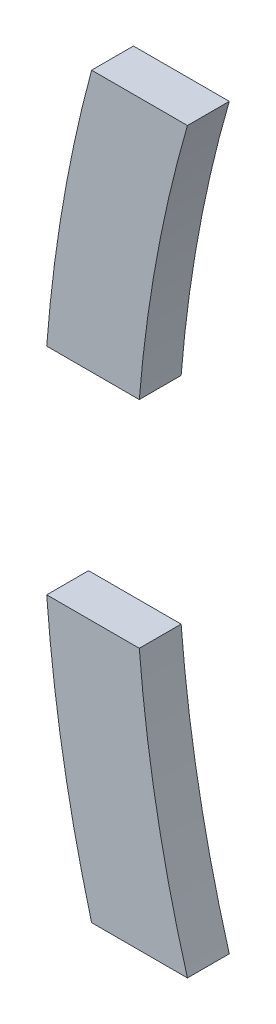
ISO-10303-21;
HEADER;
FILE_DESCRIPTION(('STEP AP214'),'2;1');
FILE_NAME('part.step','',(''),(''),'','','');
FILE_SCHEMA(('AUTOMOTIVE_DESIGN { 1 0 10303 214 1 1 1 1 }'));
ENDSEC;
DATA;
#1=APPLICATION_CONTEXT('core data for automotive mechanical design processes');
#2=APPLICATION_PROTOCOL_DEFINITION('international standard','automotive_design',2000,#1);
#3=PRODUCT_CONTEXT('',#1,'mechanical');
#4=PRODUCT('Part','Part','',(#3));
#5=PRODUCT_RELATED_PRODUCT_CATEGORY('part','',(#4));
#6=PRODUCT_DEFINITION_FORMATION('','',#4);
#7=PRODUCT_DEFINITION_CONTEXT('part definition',#1,'design');
#8=PRODUCT_DEFINITION('design','',#6,#7);
#9=PRODUCT_DEFINITION_SHAPE('','',#8);
#10=(LENGTH_UNIT() NAMED_UNIT(*) SI_UNIT(.MILLI.,.METRE.));
#11=(NAMED_UNIT(*) PLANE_ANGLE_UNIT() SI_UNIT($,.RADIAN.));
#12=(NAMED_UNIT(*) SI_UNIT($,.STERADIAN.) SOLID_ANGLE_UNIT());
#13=UNCERTAINTY_MEASURE_WITH_UNIT(LENGTH_MEASURE(1.E-05),#10,'distance_accuracy_value','');
#14=(GEOMETRIC_REPRESENTATION_CONTEXT(3) GLOBAL_UNCERTAINTY_ASSIGNED_CONTEXT((#13)) GLOBAL_UNIT_ASSIGNED_CONTEXT((#10,
#11,#12)) REPRESENTATION_CONTEXT('',''));
#15=CARTESIAN_POINT('',(0.,0.,0.));
#16=DIRECTION('',(0.,0.,1.));
#17=DIRECTION('',(1.,0.,0.));
#18=AXIS2_PLACEMENT_3D('',#15,#16,#17);
#19=CARTESIAN_POINT('',(0.,0.,17.272));
#20=DIRECTION('',(0.,0.,1.));
#21=DIRECTION('',(1.,0.,0.));
#22=AXIS2_PLACEMENT_3D('',#19,#20,#21);
#23=PLANE('',#22);
#24=CARTESIAN_POINT('',(0.,0.,17.272));
#25=DIRECTION('',(0.,0.,1.));
#26=DIRECTION('',(1.,0.,0.));
#27=AXIS2_PLACEMENT_3D('',#24,#25,#26);
#28=CIRCLE('',#27,584.2);
#29=CARTESIAN_POINT('',(-582.506512839127,-44.4500000000001,17.272));
#30=VERTEX_POINT('',#29);
#31=CARTESIAN_POINT('',(-563.971524103833,-152.4,17.272));
#32=VERTEX_POINT('',#31);
#33=EDGE_CURVE('E90',#30,#32,#28,.T.);
#34=ORIENTED_EDGE('',*,*,#33,.T.);
#35=DIRECTION('',(1.,0.,0.));
#36=VECTOR('',#35,1.);
#37=CARTESIAN_POINT('',(0.,-152.4,17.272));
#38=LINE('',#37,#36);
#39=CARTESIAN_POINT('',(-524.403899680389,-152.4,17.272));
#40=VERTEX_POINT('',#39);
#41=EDGE_CURVE('E81',#32,#40,#38,.T.);
#42=ORIENTED_EDGE('',*,*,#41,.T.);
#43=CARTESIAN_POINT('',(0.,0.,17.272));
#44=DIRECTION('',(0.,0.,-1.));
#45=DIRECTION('',(1.,0.,0.));
#46=AXIS2_PLACEMENT_3D('',#43,#44,#45);
#47=CIRCLE('',#46,546.1);
#48=CARTESIAN_POINT('',(-544.287982138132,-44.4500000000001,17.272));
#49=VERTEX_POINT('',#48);
#50=EDGE_CURVE('E89',#40,#49,#47,.T.);
#51=ORIENTED_EDGE('',*,*,#50,.T.);
#52=DIRECTION('',(1.,0.,0.));
#53=VECTOR('',#52,1.);
#54=CARTESIAN_POINT('',(0.,-44.4500000000001,17.272));
#55=LINE('',#54,#53);
#56=EDGE_CURVE('E55',#30,#49,#55,.T.);
#57=ORIENTED_EDGE('',*,*,#56,.F.);
#58=EDGE_LOOP('',(#34,#42,#51,#57));
#59=FACE_BOUND('',#58,.T.);
#60=ADVANCED_FACE('F46',(#59),#23,.T.);
#61=CARTESIAN_POINT('',(0.,0.,0.));
#62=DIRECTION('',(0.,0.,1.));
#63=DIRECTION('',(1.,0.,0.));
#64=AXIS2_PLACEMENT_3D('',#61,#62,#63);
#65=PLANE('',#64);
#66=DIRECTION('',(-1.,0.,0.));
#67=VECTOR('',#66,1.);
#68=CARTESIAN_POINT('',(0.,-152.4,0.));
#69=LINE('',#68,#67);
#70=CARTESIAN_POINT('',(-524.403899680389,-152.4,0.));
#71=VERTEX_POINT('',#70);
#72=CARTESIAN_POINT('',(-563.971524103833,-152.4,0.));
#73=VERTEX_POINT('',#72);
#74=EDGE_CURVE('E61',#71,#73,#69,.T.);
#75=ORIENTED_EDGE('',*,*,#74,.T.);
#76=CARTESIAN_POINT('',(0.,0.,0.));
#77=DIRECTION('',(0.,0.,1.));
#78=DIRECTION('',(1.,0.,0.));
#79=AXIS2_PLACEMENT_3D('',#76,#77,#78);
#80=CIRCLE('',#79,584.2);
#81=CARTESIAN_POINT('',(-582.506512839127,-44.4500000000001,0.));
#82=VERTEX_POINT('',#81);
#83=EDGE_CURVE('E98',#82,#73,#80,.T.);
#84=ORIENTED_EDGE('',*,*,#83,.F.);
#85=DIRECTION('',(-1.,0.,0.));
#86=VECTOR('',#85,1.);
#87=CARTESIAN_POINT('',(0.,-44.4500000000001,0.));
#88=LINE('',#87,#86);
#89=CARTESIAN_POINT('',(-544.287982138132,-44.4500000000001,0.));
#90=VERTEX_POINT('',#89);
#91=EDGE_CURVE('E104',#90,#82,#88,.T.);
#92=ORIENTED_EDGE('',*,*,#91,.F.);
#93=CARTESIAN_POINT('',(0.,0.,0.));
#94=DIRECTION('',(0.,0.,-1.));
#95=DIRECTION('',(1.,0.,0.));
#96=AXIS2_PLACEMENT_3D('',#93,#94,#95);
#97=CIRCLE('',#96,546.1);
#98=EDGE_CURVE('E49',#71,#90,#97,.T.);
#99=ORIENTED_EDGE('',*,*,#98,.F.);
#100=EDGE_LOOP('',(#75,#84,#92,#99));
#101=FACE_BOUND('',#100,.T.);
#102=ADVANCED_FACE('F120',(#101),#65,.F.);
#103=CARTESIAN_POINT('',(0.,0.,17.272));
#104=DIRECTION('',(0.,0.,-1.));
#105=DIRECTION('',(-1.,0.,0.));
#106=AXIS2_PLACEMENT_3D('',#103,#104,#105);
#107=CYLINDRICAL_SURFACE('',#106,546.1);
#108=DIRECTION('',(0.,0.,1.));
#109=VECTOR('',#108,1.);
#110=CARTESIAN_POINT('',(-524.403899680389,-152.4,-112.557965060382));
#111=LINE('',#110,#109);
#112=EDGE_CURVE('E12',#71,#40,#111,.T.);
#113=ORIENTED_EDGE('',*,*,#112,.F.);
#114=ORIENTED_EDGE('',*,*,#98,.T.);
#115=DIRECTION('',(0.,0.,1.));
#116=VECTOR('',#115,1.);
#117=CARTESIAN_POINT('',(-544.287982138132,-44.4500000000001,-112.557965060382));
#118=LINE('',#117,#116);
#119=EDGE_CURVE('E99',#90,#49,#118,.T.);
#120=ORIENTED_EDGE('',*,*,#119,.T.);
#121=ORIENTED_EDGE('',*,*,#50,.F.);
#122=EDGE_LOOP('',(#113,#114,#120,#121));
#123=FACE_BOUND('',#122,.T.);
#124=ADVANCED_FACE('F118',(#123),#107,.F.);
#125=CARTESIAN_POINT('',(0.,0.,17.272));
#126=DIRECTION('',(0.,0.,-1.));
#127=DIRECTION('',(-1.,0.,0.));
#128=AXIS2_PLACEMENT_3D('',#125,#126,#127);
#129=CYLINDRICAL_SURFACE('',#128,584.2);
#130=DIRECTION('',(0.,0.,1.));
#131=VECTOR('',#130,1.);
#132=CARTESIAN_POINT('',(-563.971524103833,-152.4,-112.557965060382));
#133=LINE('',#132,#131);
#134=EDGE_CURVE('E84',#73,#32,#133,.T.);
#135=ORIENTED_EDGE('',*,*,#134,.T.);
#136=ORIENTED_EDGE('',*,*,#33,.F.);
#137=DIRECTION('',(0.,0.,1.));
#138=VECTOR('',#137,1.);
#139=CARTESIAN_POINT('',(-582.506512839127,-44.4500000000001,-112.557965060382));
#140=LINE('',#139,#138);
#141=EDGE_CURVE('E105',#82,#30,#140,.T.);
#142=ORIENTED_EDGE('',*,*,#141,.F.);
#143=ORIENTED_EDGE('',*,*,#83,.T.);
#144=EDGE_LOOP('',(#135,#136,#142,#143));
#145=FACE_BOUND('',#144,.T.);
#146=ADVANCED_FACE('F95',(#145),#129,.T.);
#147=CARTESIAN_POINT('',(0.,-44.4500000000001,-112.557965060382));
#148=DIRECTION('',(0.,-1.,0.));
#149=DIRECTION('',(0.,0.,-1.));
#150=AXIS2_PLACEMENT_3D('',#147,#148,#149);
#151=PLANE('',#150);
#152=ORIENTED_EDGE('',*,*,#91,.T.);
#153=ORIENTED_EDGE('',*,*,#141,.T.);
#154=ORIENTED_EDGE('',*,*,#56,.T.);
#155=ORIENTED_EDGE('',*,*,#119,.F.);
#156=EDGE_LOOP('',(#152,#153,#154,#155));
#157=FACE_BOUND('',#156,.T.);
#158=ADVANCED_FACE('F119',(#157),#151,.F.);
#159=CARTESIAN_POINT('',(0.,-152.4,-112.557965060382));
#160=DIRECTION('',(0.,-1.,0.));
#161=DIRECTION('',(0.,0.,-1.));
#162=AXIS2_PLACEMENT_3D('',#159,#160,#161);
#163=PLANE('',#162);
#164=ORIENTED_EDGE('',*,*,#112,.T.);
#165=ORIENTED_EDGE('',*,*,#41,.F.);
#166=ORIENTED_EDGE('',*,*,#134,.F.);
#167=ORIENTED_EDGE('',*,*,#74,.F.);
#168=EDGE_LOOP('',(#164,#165,#166,#167));
#169=FACE_BOUND('',#168,.T.);
#170=ADVANCED_FACE('F83',(#169),#163,.T.);
#171=CLOSED_SHELL('',(#60,#102,#124,#146,#158,#170));
#172=MANIFOLD_SOLID_BREP('B2',#171);
#173=CARTESIAN_POINT('',(0.,0.,17.272));
#174=DIRECTION('',(0.,0.,-1.));
#175=DIRECTION('',(-1.,0.,0.));
#176=AXIS2_PLACEMENT_3D('',#173,#174,#175);
#177=CYLINDRICAL_SURFACE('',#176,546.1);
#178=DIRECTION('',(0.,0.,1.));
#179=VECTOR('',#178,1.);
#180=CARTESIAN_POINT('',(-544.287982138132,44.4499999999999,-112.557965060382));
#181=LINE('',#180,#179);
#182=CARTESIAN_POINT('',(-544.287982138132,44.4499999999999,0.));
#183=VERTEX_POINT('',#182);
#184=CARTESIAN_POINT('',(-544.287982138132,44.4499999999999,17.272));
#185=VERTEX_POINT('',#184);
#186=EDGE_CURVE('E228',#183,#185,#181,.T.);
#187=ORIENTED_EDGE('',*,*,#186,.F.);
#188=CARTESIAN_POINT('',(0.,0.,0.));
#189=DIRECTION('',(0.,0.,-1.));
#190=DIRECTION('',(1.,0.,0.));
#191=AXIS2_PLACEMENT_3D('',#188,#189,#190);
#192=CIRCLE('',#191,546.1);
#193=CARTESIAN_POINT('',(-524.403899680389,152.4,0.));
#194=VERTEX_POINT('',#193);
#195=EDGE_CURVE('E222',#183,#194,#192,.T.);
#196=ORIENTED_EDGE('',*,*,#195,.T.);
#197=DIRECTION('',(0.,0.,1.));
#198=VECTOR('',#197,1.);
#199=CARTESIAN_POINT('',(-524.403899680389,152.4,-112.557965060382));
#200=LINE('',#199,#198);
#201=CARTESIAN_POINT('',(-524.403899680389,152.4,17.272));
#202=VERTEX_POINT('',#201);
#203=EDGE_CURVE('E234',#194,#202,#200,.T.);
#204=ORIENTED_EDGE('',*,*,#203,.T.);
#205=CARTESIAN_POINT('',(0.,0.,17.272));
#206=DIRECTION('',(0.,0.,-1.));
#207=DIRECTION('',(1.,0.,0.));
#208=AXIS2_PLACEMENT_3D('',#205,#206,#207);
#209=CIRCLE('',#208,546.1);
#210=EDGE_CURVE('E177',#185,#202,#209,.T.);
#211=ORIENTED_EDGE('',*,*,#210,.F.);
#212=EDGE_LOOP('',(#187,#196,#204,#211));
#213=FACE_BOUND('',#212,.T.);
#214=ADVANCED_FACE('F169',(#213),#177,.F.);
#215=CARTESIAN_POINT('',(0.,0.,17.272));
#216=DIRECTION('',(0.,0.,-1.));
#217=DIRECTION('',(-1.,0.,0.));
#218=AXIS2_PLACEMENT_3D('',#215,#216,#217);
#219=CYLINDRICAL_SURFACE('',#218,584.2);
#220=DIRECTION('',(0.,0.,1.));
#221=VECTOR('',#220,1.);
#222=CARTESIAN_POINT('',(-582.506512839127,44.4499999999999,-112.557965060382));
#223=LINE('',#222,#221);
#224=CARTESIAN_POINT('',(-582.506512839127,44.4499999999999,0.));
#225=VERTEX_POINT('',#224);
#226=CARTESIAN_POINT('',(-582.506512839127,44.4499999999999,17.272));
#227=VERTEX_POINT('',#226);
#228=EDGE_CURVE('E208',#225,#227,#223,.T.);
#229=ORIENTED_EDGE('',*,*,#228,.T.);
#230=CARTESIAN_POINT('',(0.,0.,17.272));
#231=DIRECTION('',(0.,0.,1.));
#232=DIRECTION('',(1.,0.,0.));
#233=AXIS2_PLACEMENT_3D('',#230,#231,#232);
#234=CIRCLE('',#233,584.2);
#235=CARTESIAN_POINT('',(-563.971524103833,152.4,17.272));
#236=VERTEX_POINT('',#235);
#237=EDGE_CURVE('E44',#236,#227,#234,.T.);
#238=ORIENTED_EDGE('',*,*,#237,.F.);
#239=DIRECTION('',(0.,0.,1.));
#240=VECTOR('',#239,1.);
#241=CARTESIAN_POINT('',(-563.971524103833,152.4,-112.557965060382));
#242=LINE('',#241,#240);
#243=CARTESIAN_POINT('',(-563.971524103833,152.4,0.));
#244=VERTEX_POINT('',#243);
#245=EDGE_CURVE('E225',#244,#236,#242,.T.);
#246=ORIENTED_EDGE('',*,*,#245,.F.);
#247=CARTESIAN_POINT('',(0.,0.,0.));
#248=DIRECTION('',(0.,0.,1.));
#249=DIRECTION('',(1.,0.,0.));
#250=AXIS2_PLACEMENT_3D('',#247,#248,#249);
#251=CIRCLE('',#250,584.2);
#252=EDGE_CURVE('E172',#244,#225,#251,.T.);
#253=ORIENTED_EDGE('',*,*,#252,.T.);
#254=EDGE_LOOP('',(#229,#238,#246,#253));
#255=FACE_BOUND('',#254,.T.);
#256=ADVANCED_FACE('F224',(#255),#219,.T.);
#257=CARTESIAN_POINT('',(0.,0.,0.));
#258=DIRECTION('',(0.,0.,1.));
#259=DIRECTION('',(1.,0.,0.));
#260=AXIS2_PLACEMENT_3D('',#257,#258,#259);
#261=PLANE('',#260);
#262=DIRECTION('',(-1.,0.,0.));
#263=VECTOR('',#262,1.);
#264=CARTESIAN_POINT('',(0.,44.4499999999999,0.));
#265=LINE('',#264,#263);
#266=EDGE_CURVE('E211',#183,#225,#265,.T.);
#267=ORIENTED_EDGE('',*,*,#266,.T.);
#268=ORIENTED_EDGE('',*,*,#252,.F.);
#269=DIRECTION('',(-1.,0.,0.));
#270=VECTOR('',#269,1.);
#271=CARTESIAN_POINT('',(0.,152.4,0.));
#272=LINE('',#271,#270);
#273=EDGE_CURVE('E193',#194,#244,#272,.T.);
#274=ORIENTED_EDGE('',*,*,#273,.F.);
#275=ORIENTED_EDGE('',*,*,#195,.F.);
#276=EDGE_LOOP('',(#267,#268,#274,#275));
#277=FACE_BOUND('',#276,.T.);
#278=ADVANCED_FACE('F220',(#277),#261,.F.);
#279=CARTESIAN_POINT('',(0.,0.,17.272));
#280=DIRECTION('',(0.,0.,1.));
#281=DIRECTION('',(1.,0.,0.));
#282=AXIS2_PLACEMENT_3D('',#279,#280,#281);
#283=PLANE('',#282);
#284=ORIENTED_EDGE('',*,*,#237,.T.);
#285=DIRECTION('',(1.,0.,0.));
#286=VECTOR('',#285,1.);
#287=CARTESIAN_POINT('',(0.,44.4499999999999,17.272));
#288=LINE('',#287,#286);
#289=EDGE_CURVE('E185',#227,#185,#288,.T.);
#290=ORIENTED_EDGE('',*,*,#289,.T.);
#291=ORIENTED_EDGE('',*,*,#210,.T.);
#292=DIRECTION('',(1.,0.,0.));
#293=VECTOR('',#292,1.);
#294=CARTESIAN_POINT('',(0.,152.4,17.272));
#295=LINE('',#294,#293);
#296=EDGE_CURVE('E236',#236,#202,#295,.T.);
#297=ORIENTED_EDGE('',*,*,#296,.F.);
#298=EDGE_LOOP('',(#284,#290,#291,#297));
#299=FACE_BOUND('',#298,.T.);
#300=ADVANCED_FACE('F241',(#299),#283,.T.);
#301=CARTESIAN_POINT('',(0.,152.4,-112.557965060382));
#302=DIRECTION('',(0.,-1.,0.));
#303=DIRECTION('',(0.,0.,-1.));
#304=AXIS2_PLACEMENT_3D('',#301,#302,#303);
#305=PLANE('',#304);
#306=ORIENTED_EDGE('',*,*,#273,.T.);
#307=ORIENTED_EDGE('',*,*,#245,.T.);
#308=ORIENTED_EDGE('',*,*,#296,.T.);
#309=ORIENTED_EDGE('',*,*,#203,.F.);
#310=EDGE_LOOP('',(#306,#307,#308,#309));
#311=FACE_BOUND('',#310,.T.);
#312=ADVANCED_FACE('F243',(#311),#305,.F.);
#313=CARTESIAN_POINT('',(0.,44.4499999999999,-112.557965060382));
#314=DIRECTION('',(0.,-1.,0.));
#315=DIRECTION('',(0.,0.,-1.));
#316=AXIS2_PLACEMENT_3D('',#313,#314,#315);
#317=PLANE('',#316);
#318=ORIENTED_EDGE('',*,*,#186,.T.);
#319=ORIENTED_EDGE('',*,*,#289,.F.);
#320=ORIENTED_EDGE('',*,*,#228,.F.);
#321=ORIENTED_EDGE('',*,*,#266,.F.);
#322=EDGE_LOOP('',(#318,#319,#320,#321));
#323=FACE_BOUND('',#322,.T.);
#324=ADVANCED_FACE('F210',(#323),#317,.T.);
#325=CLOSED_SHELL('',(#214,#256,#278,#300,#312,#324));
#326=MANIFOLD_SOLID_BREP('B6',#325);
#327=ADVANCED_BREP_SHAPE_REPRESENTATION('',(#18,#172,#326),#14);
#328=SHAPE_DEFINITION_REPRESENTATION(#9,#327);
ENDSEC;
END-ISO-10303-21;
